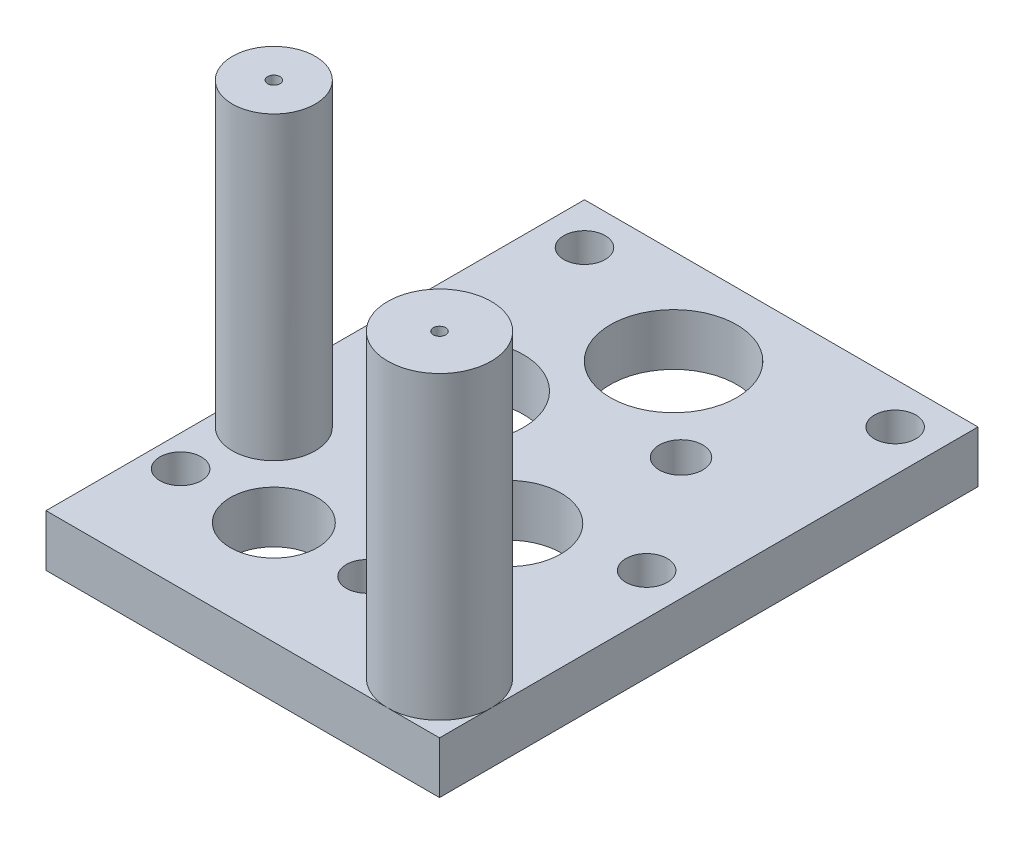
ISO-10303-21;
HEADER;
FILE_DESCRIPTION(('STEP AP214'),'2;1');
FILE_NAME('part.step','',(''),(''),'','','');
FILE_SCHEMA(('AUTOMOTIVE_DESIGN { 1 0 10303 214 1 1 1 1 }'));
ENDSEC;
DATA;
#1=APPLICATION_CONTEXT('core data for automotive mechanical design processes');
#2=APPLICATION_PROTOCOL_DEFINITION('international standard','automotive_design',2000,#1);
#3=PRODUCT_CONTEXT('',#1,'mechanical');
#4=PRODUCT('Part','Part','',(#3));
#5=PRODUCT_RELATED_PRODUCT_CATEGORY('part','',(#4));
#6=PRODUCT_DEFINITION_FORMATION('','',#4);
#7=PRODUCT_DEFINITION_CONTEXT('part definition',#1,'design');
#8=PRODUCT_DEFINITION('design','',#6,#7);
#9=PRODUCT_DEFINITION_SHAPE('','',#8);
#10=(LENGTH_UNIT() NAMED_UNIT(*) SI_UNIT(.MILLI.,.METRE.));
#11=(NAMED_UNIT(*) PLANE_ANGLE_UNIT() SI_UNIT($,.RADIAN.));
#12=(NAMED_UNIT(*) SI_UNIT($,.STERADIAN.) SOLID_ANGLE_UNIT());
#13=UNCERTAINTY_MEASURE_WITH_UNIT(LENGTH_MEASURE(1.E-05),#10,'distance_accuracy_value','');
#14=(GEOMETRIC_REPRESENTATION_CONTEXT(3) GLOBAL_UNCERTAINTY_ASSIGNED_CONTEXT((#13)) GLOBAL_UNIT_ASSIGNED_CONTEXT((#10,
#11,#12)) REPRESENTATION_CONTEXT('',''));
#15=CARTESIAN_POINT('',(0.,0.,0.));
#16=DIRECTION('',(0.,0.,1.));
#17=DIRECTION('',(1.,0.,0.));
#18=AXIS2_PLACEMENT_3D('',#15,#16,#17);
#19=CARTESIAN_POINT('',(0.,2.5,0.));
#20=DIRECTION('',(0.,-1.,0.));
#21=DIRECTION('',(0.,0.,-1.));
#22=AXIS2_PLACEMENT_3D('',#19,#20,#21);
#23=PLANE('',#22);
#24=CARTESIAN_POINT('',(11.5,2.5,12.5));
#25=DIRECTION('',(0.,1.,0.));
#26=DIRECTION('',(0.,0.,1.));
#27=AXIS2_PLACEMENT_3D('',#24,#25,#26);
#28=CIRCLE('',#27,2.5);
#29=CARTESIAN_POINT('',(11.5,2.5,15.));
#30=VERTEX_POINT('',#29);
#31=CARTESIAN_POINT('',(14.,2.5,12.5));
#32=VERTEX_POINT('',#31);
#33=EDGE_CURVE('E189',#30,#32,#28,.T.);
#34=ORIENTED_EDGE('',*,*,#33,.F.);
#35=DIRECTION('',(1.,0.,0.));
#36=VECTOR('',#35,1.);
#37=CARTESIAN_POINT('',(-5.,2.5,15.));
#38=LINE('',#37,#36);
#39=CARTESIAN_POINT('',(14.,2.5,15.));
#40=VERTEX_POINT('',#39);
#41=EDGE_CURVE('E178',#30,#40,#38,.T.);
#42=ORIENTED_EDGE('',*,*,#41,.T.);
#43=DIRECTION('',(0.,0.,1.));
#44=VECTOR('',#43,1.);
#45=CARTESIAN_POINT('',(14.,2.5,-11.));
#46=LINE('',#45,#44);
#47=EDGE_CURVE('E190',#32,#40,#46,.T.);
#48=ORIENTED_EDGE('',*,*,#47,.F.);
#49=EDGE_LOOP('',(#34,#42,#48));
#50=FACE_BOUND('',#49,.T.);
#51=ADVANCED_FACE('F112',(#50),#23,.F.);
#52=CARTESIAN_POINT('',(12.,2.5,2.99999999999999));
#53=DIRECTION('',(0.,1.,0.));
#54=DIRECTION('',(0.,0.,1.));
#55=AXIS2_PLACEMENT_3D('',#52,#53,#54);
#56=CIRCLE('',#55,1.00000000000001);
#57=CARTESIAN_POINT('',(12.,2.5,4.));
#58=VERTEX_POINT('',#57);
#59=EDGE_CURVE('E292',#58,#58,#56,.T.);
#60=ORIENTED_EDGE('',*,*,#59,.F.);
#61=EDGE_LOOP('',(#60));
#62=FACE_BOUND('',#61,.T.);
#63=CARTESIAN_POINT('',(-3.,2.5,-9.));
#64=DIRECTION('',(0.,1.,0.));
#65=DIRECTION('',(0.,0.,1.));
#66=AXIS2_PLACEMENT_3D('',#63,#64,#65);
#67=CIRCLE('',#66,1.);
#68=CARTESIAN_POINT('',(-3.,2.5,-8.));
#69=VERTEX_POINT('',#68);
#70=EDGE_CURVE('E307',#69,#69,#67,.T.);
#71=ORIENTED_EDGE('',*,*,#70,.F.);
#72=EDGE_LOOP('',(#71));
#73=FACE_BOUND('',#72,.T.);
#74=CARTESIAN_POINT('',(12.,2.5,-9.00000000000001));
#75=DIRECTION('',(0.,1.,0.));
#76=DIRECTION('',(0.,0.,1.));
#77=AXIS2_PLACEMENT_3D('',#74,#75,#76);
#78=CIRCLE('',#77,1.);
#79=CARTESIAN_POINT('',(12.,2.5,-8.));
#80=VERTEX_POINT('',#79);
#81=EDGE_CURVE('E304',#80,#80,#78,.T.);
#82=ORIENTED_EDGE('',*,*,#81,.F.);
#83=EDGE_LOOP('',(#82));
#84=FACE_BOUND('',#83,.T.);
#85=EDGE_CURVE('E129',#32,#30,#28,.T.);
#86=ORIENTED_EDGE('',*,*,#85,.F.);
#87=CARTESIAN_POINT('',(14.,2.5,-11.));
#88=VERTEX_POINT('',#87);
#89=EDGE_CURVE('E187',#88,#32,#46,.T.);
#90=ORIENTED_EDGE('',*,*,#89,.F.);
#91=DIRECTION('',(1.,0.,0.));
#92=VECTOR('',#91,1.);
#93=CARTESIAN_POINT('',(-5.,2.5,-11.));
#94=LINE('',#93,#92);
#95=CARTESIAN_POINT('',(-5.,2.5,-11.));
#96=VERTEX_POINT('',#95);
#97=EDGE_CURVE('E259',#96,#88,#94,.T.);
#98=ORIENTED_EDGE('',*,*,#97,.F.);
#99=DIRECTION('',(0.,0.,1.));
#100=VECTOR('',#99,1.);
#101=CARTESIAN_POINT('',(-5.,2.5,-11.));
#102=LINE('',#101,#100);
#103=CARTESIAN_POINT('',(-5.,2.5,6.));
#104=VERTEX_POINT('',#103);
#105=EDGE_CURVE('E263',#96,#104,#102,.T.);
#106=ORIENTED_EDGE('',*,*,#105,.T.);
#107=CARTESIAN_POINT('',(-3.,2.5,6.));
#108=DIRECTION('',(0.,1.,0.));
#109=DIRECTION('',(0.,0.,1.));
#110=AXIS2_PLACEMENT_3D('',#107,#108,#109);
#111=CIRCLE('',#110,2.);
#112=EDGE_CURVE('E192',#104,#104,#111,.T.);
#113=ORIENTED_EDGE('',*,*,#112,.F.);
#114=CARTESIAN_POINT('',(-5.,2.5,15.));
#115=VERTEX_POINT('',#114);
#116=EDGE_CURVE('E174',#104,#115,#102,.T.);
#117=ORIENTED_EDGE('',*,*,#116,.T.);
#118=EDGE_CURVE('E168',#115,#30,#38,.T.);
#119=ORIENTED_EDGE('',*,*,#118,.T.);
#120=EDGE_LOOP('',(#86,#90,#98,#106,#113,#117,#119));
#121=FACE_BOUND('',#120,.T.);
#122=CARTESIAN_POINT('',(-3.49999999999999,2.5,10.));
#123=DIRECTION('',(0.,-1.,0.));
#124=DIRECTION('',(0.,0.,-1.));
#125=AXIS2_PLACEMENT_3D('',#122,#123,#124);
#126=CIRCLE('',#125,1.);
#127=CARTESIAN_POINT('',(-3.49999999999999,2.5,9.));
#128=VERTEX_POINT('',#127);
#129=EDGE_CURVE('E219',#128,#128,#126,.T.);
#130=ORIENTED_EDGE('',*,*,#129,.T.);
#131=EDGE_LOOP('',(#130));
#132=FACE_BOUND('',#131,.T.);
#133=CARTESIAN_POINT('',(5.50000000000001,2.5,10.));
#134=DIRECTION('',(0.,-1.,0.));
#135=DIRECTION('',(0.,0.,-1.));
#136=AXIS2_PLACEMENT_3D('',#133,#134,#135);
#137=CIRCLE('',#136,1.);
#138=CARTESIAN_POINT('',(5.50000000000001,2.5,9.));
#139=VERTEX_POINT('',#138);
#140=EDGE_CURVE('E222',#139,#139,#137,.T.);
#141=ORIENTED_EDGE('',*,*,#140,.T.);
#142=EDGE_LOOP('',(#141));
#143=FACE_BOUND('',#142,.T.);
#144=CARTESIAN_POINT('',(8.10714951623889,2.5,-2.55423701354193));
#145=DIRECTION('',(0.,1.,0.));
#146=DIRECTION('',(0.,0.,1.));
#147=AXIS2_PLACEMENT_3D('',#144,#145,#146);
#148=CIRCLE('',#147,1.05);
#149=CARTESIAN_POINT('',(8.10714951623889,2.5,-1.50423701354193));
#150=VERTEX_POINT('',#149);
#151=EDGE_CURVE('E253',#150,#150,#148,.T.);
#152=ORIENTED_EDGE('',*,*,#151,.F.);
#153=EDGE_LOOP('',(#152));
#154=FACE_BOUND('',#153,.T.);
#155=CARTESIAN_POINT('',(0.,2.5,0.));
#156=DIRECTION('',(0.,1.,0.));
#157=DIRECTION('',(0.,0.,1.));
#158=AXIS2_PLACEMENT_3D('',#155,#156,#157);
#159=CIRCLE('',#158,3.05);
#160=CARTESIAN_POINT('',(0.,2.5,3.05));
#161=VERTEX_POINT('',#160);
#162=EDGE_CURVE('E247',#161,#161,#159,.T.);
#163=ORIENTED_EDGE('',*,*,#162,.F.);
#164=EDGE_LOOP('',(#163));
#165=FACE_BOUND('',#164,.T.);
#166=CARTESIAN_POINT('',(3.9,2.5,-6.4));
#167=DIRECTION('',(0.,1.,0.));
#168=DIRECTION('',(0.,0.,1.));
#169=AXIS2_PLACEMENT_3D('',#166,#167,#168);
#170=CIRCLE('',#169,3.05);
#171=CARTESIAN_POINT('',(3.9,2.5,-3.35));
#172=VERTEX_POINT('',#171);
#173=EDGE_CURVE('E241',#172,#172,#170,.T.);
#174=ORIENTED_EDGE('',*,*,#173,.F.);
#175=EDGE_LOOP('',(#174));
#176=FACE_BOUND('',#175,.T.);
#177=CARTESIAN_POINT('',(6.69405655718959,2.5,4.38059434428104));
#178=DIRECTION('',(0.,1.,0.));
#179=DIRECTION('',(0.,0.,1.));
#180=AXIS2_PLACEMENT_3D('',#177,#178,#179);
#181=CIRCLE('',#180,2.55);
#182=CARTESIAN_POINT('',(6.69405655718959,2.5,6.93059434428104));
#183=VERTEX_POINT('',#182);
#184=EDGE_CURVE('E235',#183,#183,#181,.T.);
#185=ORIENTED_EDGE('',*,*,#184,.F.);
#186=EDGE_LOOP('',(#185));
#187=FACE_BOUND('',#186,.T.);
#188=CARTESIAN_POINT('',(1.00000000000001,2.5,10.));
#189=DIRECTION('',(0.,1.,0.));
#190=DIRECTION('',(0.,0.,1.));
#191=AXIS2_PLACEMENT_3D('',#188,#189,#190);
#192=CIRCLE('',#191,2.1);
#193=CARTESIAN_POINT('',(1.00000000000001,2.5,12.1));
#194=VERTEX_POINT('',#193);
#195=EDGE_CURVE('E229',#194,#194,#192,.T.);
#196=ORIENTED_EDGE('',*,*,#195,.F.);
#197=EDGE_LOOP('',(#196));
#198=FACE_BOUND('',#197,.T.);
#199=ADVANCED_FACE('F170',(#62,#73,#84,#121,#132,#143,#154,#165,#176,#187,#198),#23,.F.);
#200=CARTESIAN_POINT('',(0.,0.,0.));
#201=DIRECTION('',(0.,-1.,0.));
#202=DIRECTION('',(0.,0.,-1.));
#203=AXIS2_PLACEMENT_3D('',#200,#201,#202);
#204=PLANE('',#203);
#205=CARTESIAN_POINT('',(12.,0.,2.99999999999999));
#206=DIRECTION('',(0.,1.,0.));
#207=DIRECTION('',(0.,0.,1.));
#208=AXIS2_PLACEMENT_3D('',#205,#206,#207);
#209=CIRCLE('',#208,0.700000000000002);
#210=CARTESIAN_POINT('',(12.,0.,3.7));
#211=VERTEX_POINT('',#210);
#212=EDGE_CURVE('E702',#211,#211,#209,.T.);
#213=ORIENTED_EDGE('',*,*,#212,.T.);
#214=EDGE_LOOP('',(#213));
#215=FACE_BOUND('',#214,.T.);
#216=CARTESIAN_POINT('',(-3.,0.,-9.));
#217=DIRECTION('',(0.,1.,0.));
#218=DIRECTION('',(0.,0.,1.));
#219=AXIS2_PLACEMENT_3D('',#216,#217,#218);
#220=CIRCLE('',#219,0.699999999999999);
#221=CARTESIAN_POINT('',(-3.,0.,-8.3));
#222=VERTEX_POINT('',#221);
#223=EDGE_CURVE('E706',#222,#222,#220,.T.);
#224=ORIENTED_EDGE('',*,*,#223,.T.);
#225=EDGE_LOOP('',(#224));
#226=FACE_BOUND('',#225,.T.);
#227=CARTESIAN_POINT('',(12.,0.,-9.00000000000001));
#228=DIRECTION('',(0.,1.,0.));
#229=DIRECTION('',(0.,0.,1.));
#230=AXIS2_PLACEMENT_3D('',#227,#228,#229);
#231=CIRCLE('',#230,0.699999999999999);
#232=CARTESIAN_POINT('',(12.,0.,-8.30000000000001));
#233=VERTEX_POINT('',#232);
#234=EDGE_CURVE('E283',#233,#233,#231,.T.);
#235=ORIENTED_EDGE('',*,*,#234,.T.);
#236=EDGE_LOOP('',(#235));
#237=FACE_BOUND('',#236,.T.);
#238=CARTESIAN_POINT('',(-3.49999999999999,0.,10.));
#239=DIRECTION('',(0.,1.,0.));
#240=DIRECTION('',(0.,0.,1.));
#241=AXIS2_PLACEMENT_3D('',#238,#239,#240);
#242=CIRCLE('',#241,0.8);
#243=CARTESIAN_POINT('',(-3.49999999999999,0.,10.8));
#244=VERTEX_POINT('',#243);
#245=EDGE_CURVE('E209',#244,#244,#242,.T.);
#246=ORIENTED_EDGE('',*,*,#245,.T.);
#247=EDGE_LOOP('',(#246));
#248=FACE_BOUND('',#247,.T.);
#249=CARTESIAN_POINT('',(5.50000000000001,0.,10.));
#250=DIRECTION('',(0.,1.,0.));
#251=DIRECTION('',(0.,0.,1.));
#252=AXIS2_PLACEMENT_3D('',#249,#250,#251);
#253=CIRCLE('',#252,0.800000000000001);
#254=CARTESIAN_POINT('',(5.50000000000001,0.,10.8));
#255=VERTEX_POINT('',#254);
#256=EDGE_CURVE('E206',#255,#255,#253,.T.);
#257=ORIENTED_EDGE('',*,*,#256,.T.);
#258=EDGE_LOOP('',(#257));
#259=FACE_BOUND('',#258,.T.);
#260=CARTESIAN_POINT('',(6.69405655718959,0.,4.38059434428104));
#261=DIRECTION('',(0.,1.,0.));
#262=DIRECTION('',(0.,0.,1.));
#263=AXIS2_PLACEMENT_3D('',#260,#261,#262);
#264=CIRCLE('',#263,2.55);
#265=CARTESIAN_POINT('',(6.69405655718959,0.,6.93059434428104));
#266=VERTEX_POINT('',#265);
#267=EDGE_CURVE('E232',#266,#266,#264,.T.);
#268=ORIENTED_EDGE('',*,*,#267,.T.);
#269=EDGE_LOOP('',(#268));
#270=FACE_BOUND('',#269,.T.);
#271=CARTESIAN_POINT('',(0.,0.,0.));
#272=DIRECTION('',(0.,1.,0.));
#273=DIRECTION('',(0.,0.,1.));
#274=AXIS2_PLACEMENT_3D('',#271,#272,#273);
#275=CIRCLE('',#274,3.05);
#276=CARTESIAN_POINT('',(0.,0.,3.05));
#277=VERTEX_POINT('',#276);
#278=EDGE_CURVE('E244',#277,#277,#275,.T.);
#279=ORIENTED_EDGE('',*,*,#278,.T.);
#280=EDGE_LOOP('',(#279));
#281=FACE_BOUND('',#280,.T.);
#282=DIRECTION('',(1.,0.,0.));
#283=VECTOR('',#282,1.);
#284=CARTESIAN_POINT('',(-5.,0.,-11.));
#285=LINE('',#284,#283);
#286=CARTESIAN_POINT('',(-5.,0.,-11.));
#287=VERTEX_POINT('',#286);
#288=CARTESIAN_POINT('',(14.,0.,-11.));
#289=VERTEX_POINT('',#288);
#290=EDGE_CURVE('E256',#287,#289,#285,.T.);
#291=ORIENTED_EDGE('',*,*,#290,.T.);
#292=DIRECTION('',(0.,0.,1.));
#293=VECTOR('',#292,1.);
#294=CARTESIAN_POINT('',(14.,0.,-11.));
#295=LINE('',#294,#293);
#296=CARTESIAN_POINT('',(14.,0.,15.));
#297=VERTEX_POINT('',#296);
#298=EDGE_CURVE('E267',#289,#297,#295,.T.);
#299=ORIENTED_EDGE('',*,*,#298,.T.);
#300=DIRECTION('',(1.,0.,0.));
#301=VECTOR('',#300,1.);
#302=CARTESIAN_POINT('',(-5.,0.,15.));
#303=LINE('',#302,#301);
#304=CARTESIAN_POINT('',(-5.,0.,15.));
#305=VERTEX_POINT('',#304);
#306=EDGE_CURVE('E270',#305,#297,#303,.T.);
#307=ORIENTED_EDGE('',*,*,#306,.F.);
#308=DIRECTION('',(0.,0.,1.));
#309=VECTOR('',#308,1.);
#310=CARTESIAN_POINT('',(-5.,0.,-11.));
#311=LINE('',#310,#309);
#312=EDGE_CURVE('E261',#287,#305,#311,.T.);
#313=ORIENTED_EDGE('',*,*,#312,.F.);
#314=EDGE_LOOP('',(#291,#299,#307,#313));
#315=FACE_BOUND('',#314,.T.);
#316=CARTESIAN_POINT('',(8.10714951623889,0.,-2.55423701354193));
#317=DIRECTION('',(0.,1.,0.));
#318=DIRECTION('',(0.,0.,1.));
#319=AXIS2_PLACEMENT_3D('',#316,#317,#318);
#320=CIRCLE('',#319,1.05);
#321=CARTESIAN_POINT('',(8.10714951623889,0.,-1.50423701354193));
#322=VERTEX_POINT('',#321);
#323=EDGE_CURVE('E250',#322,#322,#320,.T.);
#324=ORIENTED_EDGE('',*,*,#323,.T.);
#325=EDGE_LOOP('',(#324));
#326=FACE_BOUND('',#325,.T.);
#327=CARTESIAN_POINT('',(3.9,0.,-6.4));
#328=DIRECTION('',(0.,1.,0.));
#329=DIRECTION('',(0.,0.,1.));
#330=AXIS2_PLACEMENT_3D('',#327,#328,#329);
#331=CIRCLE('',#330,3.05);
#332=CARTESIAN_POINT('',(3.9,0.,-3.35));
#333=VERTEX_POINT('',#332);
#334=EDGE_CURVE('E238',#333,#333,#331,.T.);
#335=ORIENTED_EDGE('',*,*,#334,.T.);
#336=EDGE_LOOP('',(#335));
#337=FACE_BOUND('',#336,.T.);
#338=CARTESIAN_POINT('',(1.00000000000001,0.,10.));
#339=DIRECTION('',(0.,1.,0.));
#340=DIRECTION('',(0.,0.,1.));
#341=AXIS2_PLACEMENT_3D('',#338,#339,#340);
#342=CIRCLE('',#341,2.1);
#343=CARTESIAN_POINT('',(1.00000000000001,0.,12.1));
#344=VERTEX_POINT('',#343);
#345=EDGE_CURVE('E218',#344,#344,#342,.T.);
#346=ORIENTED_EDGE('',*,*,#345,.T.);
#347=EDGE_LOOP('',(#346));
#348=FACE_BOUND('',#347,.T.);
#349=ADVANCED_FACE('F340',(#215,#226,#237,#248,#259,#270,#281,#315,#326,#337,#348),#204,.T.);
#350=CARTESIAN_POINT('',(-5.,2.5,-11.));
#351=DIRECTION('',(0.,0.,-1.));
#352=DIRECTION('',(-1.,0.,0.));
#353=AXIS2_PLACEMENT_3D('',#350,#351,#352);
#354=PLANE('',#353);
#355=CARTESIAN_POINT('',(-1.00000000000001,1.25,-11.));
#356=DIRECTION('',(0.,0.,1.));
#357=DIRECTION('',(1.,0.,0.));
#358=AXIS2_PLACEMENT_3D('',#355,#356,#357);
#359=CIRCLE('',#358,0.3);
#360=CARTESIAN_POINT('',(-0.700000000000008,1.25,-11.));
#361=VERTEX_POINT('',#360);
#362=EDGE_CURVE('E703',#361,#361,#359,.T.);
#363=ORIENTED_EDGE('',*,*,#362,.T.);
#364=EDGE_LOOP('',(#363));
#365=FACE_BOUND('',#364,.T.);
#366=CARTESIAN_POINT('',(3.99999999999999,1.25,-11.));
#367=DIRECTION('',(0.,0.,1.));
#368=DIRECTION('',(1.,0.,0.));
#369=AXIS2_PLACEMENT_3D('',#366,#367,#368);
#370=CIRCLE('',#369,0.3);
#371=CARTESIAN_POINT('',(4.29999999999999,1.25,-11.));
#372=VERTEX_POINT('',#371);
#373=EDGE_CURVE('E709',#372,#372,#370,.T.);
#374=ORIENTED_EDGE('',*,*,#373,.T.);
#375=EDGE_LOOP('',(#374));
#376=FACE_BOUND('',#375,.T.);
#377=ORIENTED_EDGE('',*,*,#290,.F.);
#378=DIRECTION('',(0.,-1.,0.));
#379=VECTOR('',#378,1.);
#380=CARTESIAN_POINT('',(-5.,2.5,-11.));
#381=LINE('',#380,#379);
#382=EDGE_CURVE('E12',#96,#287,#381,.T.);
#383=ORIENTED_EDGE('',*,*,#382,.F.);
#384=ORIENTED_EDGE('',*,*,#97,.T.);
#385=DIRECTION('',(0.,-1.,0.));
#386=VECTOR('',#385,1.);
#387=CARTESIAN_POINT('',(14.,2.5,-11.));
#388=LINE('',#387,#386);
#389=EDGE_CURVE('E161',#88,#289,#388,.T.);
#390=ORIENTED_EDGE('',*,*,#389,.T.);
#391=EDGE_LOOP('',(#377,#383,#384,#390));
#392=FACE_BOUND('',#391,.T.);
#393=ADVANCED_FACE('F114',(#365,#376,#392),#354,.T.);
#394=CARTESIAN_POINT('',(-5.,2.5,-11.));
#395=DIRECTION('',(1.,0.,0.));
#396=DIRECTION('',(0.,0.,-1.));
#397=AXIS2_PLACEMENT_3D('',#394,#395,#396);
#398=PLANE('',#397);
#399=ORIENTED_EDGE('',*,*,#312,.T.);
#400=DIRECTION('',(0.,-1.,0.));
#401=VECTOR('',#400,1.);
#402=CARTESIAN_POINT('',(-5.,2.5,15.));
#403=LINE('',#402,#401);
#404=EDGE_CURVE('E121',#115,#305,#403,.T.);
#405=ORIENTED_EDGE('',*,*,#404,.F.);
#406=ORIENTED_EDGE('',*,*,#116,.F.);
#407=ORIENTED_EDGE('',*,*,#105,.F.);
#408=ORIENTED_EDGE('',*,*,#382,.T.);
#409=EDGE_LOOP('',(#399,#405,#406,#407,#408));
#410=FACE_BOUND('',#409,.T.);
#411=ADVANCED_FACE('F349',(#410),#398,.F.);
#412=CARTESIAN_POINT('',(-5.,2.5,15.));
#413=DIRECTION('',(0.,0.,-1.));
#414=DIRECTION('',(-1.,0.,0.));
#415=AXIS2_PLACEMENT_3D('',#412,#413,#414);
#416=PLANE('',#415);
#417=ORIENTED_EDGE('',*,*,#306,.T.);
#418=DIRECTION('',(0.,-1.,0.));
#419=VECTOR('',#418,1.);
#420=CARTESIAN_POINT('',(14.,2.5,15.));
#421=LINE('',#420,#419);
#422=EDGE_CURVE('E184',#40,#297,#421,.T.);
#423=ORIENTED_EDGE('',*,*,#422,.F.);
#424=ORIENTED_EDGE('',*,*,#41,.F.);
#425=ORIENTED_EDGE('',*,*,#118,.F.);
#426=ORIENTED_EDGE('',*,*,#404,.T.);
#427=EDGE_LOOP('',(#417,#423,#424,#425,#426));
#428=FACE_BOUND('',#427,.T.);
#429=ADVANCED_FACE('F183',(#428),#416,.F.);
#430=CARTESIAN_POINT('',(14.,2.5,-11.));
#431=DIRECTION('',(1.,0.,0.));
#432=DIRECTION('',(0.,0.,-1.));
#433=AXIS2_PLACEMENT_3D('',#430,#431,#432);
#434=PLANE('',#433);
#435=ORIENTED_EDGE('',*,*,#298,.F.);
#436=ORIENTED_EDGE('',*,*,#389,.F.);
#437=ORIENTED_EDGE('',*,*,#89,.T.);
#438=ORIENTED_EDGE('',*,*,#47,.T.);
#439=ORIENTED_EDGE('',*,*,#422,.T.);
#440=EDGE_LOOP('',(#435,#436,#437,#438,#439));
#441=FACE_BOUND('',#440,.T.);
#442=ADVANCED_FACE('F353',(#441),#434,.T.);
#443=CARTESIAN_POINT('',(8.10714951623889,2.5,-2.55423701354193));
#444=DIRECTION('',(0.,-1.,0.));
#445=DIRECTION('',(0.,0.,-1.));
#446=AXIS2_PLACEMENT_3D('',#443,#444,#445);
#447=CYLINDRICAL_SURFACE('',#446,1.05);
#448=ORIENTED_EDGE('',*,*,#151,.T.);
#449=EDGE_LOOP('',(#448));
#450=FACE_BOUND('',#449,.T.);
#451=ORIENTED_EDGE('',*,*,#323,.F.);
#452=EDGE_LOOP('',(#451));
#453=FACE_BOUND('',#452,.T.);
#454=ADVANCED_FACE('F344',(#450,#453),#447,.F.);
#455=CARTESIAN_POINT('',(0.,2.5,0.));
#456=DIRECTION('',(0.,-1.,0.));
#457=DIRECTION('',(0.,0.,-1.));
#458=AXIS2_PLACEMENT_3D('',#455,#456,#457);
#459=CYLINDRICAL_SURFACE('',#458,3.05);
#460=ORIENTED_EDGE('',*,*,#162,.T.);
#461=EDGE_LOOP('',(#460));
#462=FACE_BOUND('',#461,.T.);
#463=ORIENTED_EDGE('',*,*,#278,.F.);
#464=EDGE_LOOP('',(#463));
#465=FACE_BOUND('',#464,.T.);
#466=ADVANCED_FACE('F358',(#462,#465),#459,.F.);
#467=CARTESIAN_POINT('',(3.9,2.5,-6.4));
#468=DIRECTION('',(0.,-1.,0.));
#469=DIRECTION('',(0.,0.,-1.));
#470=AXIS2_PLACEMENT_3D('',#467,#468,#469);
#471=CYLINDRICAL_SURFACE('',#470,3.05);
#472=ORIENTED_EDGE('',*,*,#173,.T.);
#473=EDGE_LOOP('',(#472));
#474=FACE_BOUND('',#473,.T.);
#475=ORIENTED_EDGE('',*,*,#334,.F.);
#476=EDGE_LOOP('',(#475));
#477=FACE_BOUND('',#476,.T.);
#478=ADVANCED_FACE('F409',(#474,#477),#471,.F.);
#479=CARTESIAN_POINT('',(6.69405655718959,2.5,4.38059434428104));
#480=DIRECTION('',(0.,-1.,0.));
#481=DIRECTION('',(0.,0.,-1.));
#482=AXIS2_PLACEMENT_3D('',#479,#480,#481);
#483=CYLINDRICAL_SURFACE('',#482,2.55);
#484=ORIENTED_EDGE('',*,*,#184,.T.);
#485=EDGE_LOOP('',(#484));
#486=FACE_BOUND('',#485,.T.);
#487=ORIENTED_EDGE('',*,*,#267,.F.);
#488=EDGE_LOOP('',(#487));
#489=FACE_BOUND('',#488,.T.);
#490=ADVANCED_FACE('F405',(#486,#489),#483,.F.);
#491=CARTESIAN_POINT('',(1.00000000000001,2.5,10.));
#492=DIRECTION('',(0.,-1.,0.));
#493=DIRECTION('',(0.,0.,-1.));
#494=AXIS2_PLACEMENT_3D('',#491,#492,#493);
#495=CYLINDRICAL_SURFACE('',#494,2.1);
#496=ORIENTED_EDGE('',*,*,#195,.T.);
#497=EDGE_LOOP('',(#496));
#498=FACE_BOUND('',#497,.T.);
#499=ORIENTED_EDGE('',*,*,#345,.F.);
#500=EDGE_LOOP('',(#499));
#501=FACE_BOUND('',#500,.T.);
#502=ADVANCED_FACE('F398',(#498,#501),#495,.F.);
#503=CARTESIAN_POINT('',(5.50000000000001,1.,10.));
#504=DIRECTION('',(0.,1.,0.));
#505=DIRECTION('',(0.,0.,1.));
#506=AXIS2_PLACEMENT_3D('',#503,#504,#505);
#507=CYLINDRICAL_SURFACE('',#506,1.);
#508=CARTESIAN_POINT('',(5.50000000000001,1.,10.));
#509=DIRECTION('',(0.,-1.,0.));
#510=DIRECTION('',(0.,0.,-1.));
#511=AXIS2_PLACEMENT_3D('',#508,#509,#510);
#512=CIRCLE('',#511,1.);
#513=CARTESIAN_POINT('',(5.50000000000001,1.,9.));
#514=VERTEX_POINT('',#513);
#515=EDGE_CURVE('E225',#514,#514,#512,.T.);
#516=ORIENTED_EDGE('',*,*,#515,.T.);
#517=EDGE_LOOP('',(#516));
#518=FACE_BOUND('',#517,.T.);
#519=ORIENTED_EDGE('',*,*,#140,.F.);
#520=EDGE_LOOP('',(#519));
#521=FACE_BOUND('',#520,.T.);
#522=ADVANCED_FACE('F395',(#518,#521),#507,.F.);
#523=CARTESIAN_POINT('',(5.50000000000001,1.,10.));
#524=DIRECTION('',(0.,-1.,0.));
#525=DIRECTION('',(0.,0.,-1.));
#526=AXIS2_PLACEMENT_3D('',#523,#524,#525);
#527=PLANE('',#526);
#528=CARTESIAN_POINT('',(5.50000000000001,1.,10.));
#529=DIRECTION('',(0.,-1.,0.));
#530=DIRECTION('',(0.,0.,-1.));
#531=AXIS2_PLACEMENT_3D('',#528,#529,#530);
#532=CIRCLE('',#531,0.800000000000001);
#533=CARTESIAN_POINT('',(5.50000000000001,1.,9.2));
#534=VERTEX_POINT('',#533);
#535=EDGE_CURVE('E228',#534,#534,#532,.F.);
#536=ORIENTED_EDGE('',*,*,#535,.F.);
#537=EDGE_LOOP('',(#536));
#538=FACE_BOUND('',#537,.T.);
#539=ORIENTED_EDGE('',*,*,#515,.F.);
#540=EDGE_LOOP('',(#539));
#541=FACE_BOUND('',#540,.T.);
#542=ADVANCED_FACE('F393',(#538,#541),#527,.F.);
#543=CARTESIAN_POINT('',(-3.49999999999999,1.,10.));
#544=DIRECTION('',(0.,1.,0.));
#545=DIRECTION('',(0.,0.,1.));
#546=AXIS2_PLACEMENT_3D('',#543,#544,#545);
#547=CYLINDRICAL_SURFACE('',#546,1.);
#548=CARTESIAN_POINT('',(-3.49999999999999,1.,10.));
#549=DIRECTION('',(0.,-1.,0.));
#550=DIRECTION('',(0.,0.,-1.));
#551=AXIS2_PLACEMENT_3D('',#548,#549,#550);
#552=CIRCLE('',#551,1.);
#553=CARTESIAN_POINT('',(-3.49999999999999,1.,9.));
#554=VERTEX_POINT('',#553);
#555=EDGE_CURVE('E215',#554,#554,#552,.T.);
#556=ORIENTED_EDGE('',*,*,#555,.T.);
#557=EDGE_LOOP('',(#556));
#558=FACE_BOUND('',#557,.T.);
#559=ORIENTED_EDGE('',*,*,#129,.F.);
#560=EDGE_LOOP('',(#559));
#561=FACE_BOUND('',#560,.T.);
#562=ADVANCED_FACE('F389',(#558,#561),#547,.F.);
#563=CARTESIAN_POINT('',(-3.49999999999999,1.,10.));
#564=DIRECTION('',(0.,-1.,0.));
#565=DIRECTION('',(0.,0.,-1.));
#566=AXIS2_PLACEMENT_3D('',#563,#564,#565);
#567=PLANE('',#566);
#568=CARTESIAN_POINT('',(-3.49999999999999,1.,10.));
#569=DIRECTION('',(0.,-1.,0.));
#570=DIRECTION('',(0.,0.,-1.));
#571=AXIS2_PLACEMENT_3D('',#568,#569,#570);
#572=CIRCLE('',#571,0.8);
#573=CARTESIAN_POINT('',(-3.49999999999999,1.,9.2));
#574=VERTEX_POINT('',#573);
#575=EDGE_CURVE('E212',#574,#574,#572,.F.);
#576=ORIENTED_EDGE('',*,*,#575,.F.);
#577=EDGE_LOOP('',(#576));
#578=FACE_BOUND('',#577,.T.);
#579=ORIENTED_EDGE('',*,*,#555,.F.);
#580=EDGE_LOOP('',(#579));
#581=FACE_BOUND('',#580,.T.);
#582=ADVANCED_FACE('F384',(#578,#581),#567,.F.);
#583=CARTESIAN_POINT('',(-3.49999999999999,1.5,10.));
#584=DIRECTION('',(0.,-1.,0.));
#585=DIRECTION('',(0.,0.,-1.));
#586=AXIS2_PLACEMENT_3D('',#583,#584,#585);
#587=CYLINDRICAL_SURFACE('',#586,0.8);
#588=ORIENTED_EDGE('',*,*,#245,.F.);
#589=EDGE_LOOP('',(#588));
#590=FACE_BOUND('',#589,.T.);
#591=ORIENTED_EDGE('',*,*,#575,.T.);
#592=EDGE_LOOP('',(#591));
#593=FACE_BOUND('',#592,.T.);
#594=ADVANCED_FACE('F377',(#590,#593),#587,.F.);
#595=CARTESIAN_POINT('',(5.50000000000001,1.5,10.));
#596=DIRECTION('',(0.,-1.,0.));
#597=DIRECTION('',(0.,0.,-1.));
#598=AXIS2_PLACEMENT_3D('',#595,#596,#597);
#599=CYLINDRICAL_SURFACE('',#598,0.800000000000001);
#600=ORIENTED_EDGE('',*,*,#256,.F.);
#601=EDGE_LOOP('',(#600));
#602=FACE_BOUND('',#601,.T.);
#603=ORIENTED_EDGE('',*,*,#535,.T.);
#604=EDGE_LOOP('',(#603));
#605=FACE_BOUND('',#604,.T.);
#606=ADVANCED_FACE('F368',(#602,#605),#599,.F.);
#607=CARTESIAN_POINT('',(-3.,17.,6.));
#608=DIRECTION('',(0.,-1.,0.));
#609=DIRECTION('',(0.,0.,-1.));
#610=AXIS2_PLACEMENT_3D('',#607,#608,#609);
#611=CYLINDRICAL_SURFACE('',#610,2.);
#612=CARTESIAN_POINT('',(-3.,17.,6.));
#613=DIRECTION('',(0.,1.,0.));
#614=DIRECTION('',(0.,0.,1.));
#615=AXIS2_PLACEMENT_3D('',#612,#613,#614);
#616=CIRCLE('',#615,2.);
#617=CARTESIAN_POINT('',(-3.,17.,8.));
#618=VERTEX_POINT('',#617);
#619=EDGE_CURVE('E203',#618,#618,#616,.T.);
#620=ORIENTED_EDGE('',*,*,#619,.F.);
#621=EDGE_LOOP('',(#620));
#622=FACE_BOUND('',#621,.T.);
#623=ORIENTED_EDGE('',*,*,#112,.T.);
#624=EDGE_LOOP('',(#623));
#625=FACE_BOUND('',#624,.T.);
#626=ADVANCED_FACE('F365',(#622,#625),#611,.T.);
#627=CARTESIAN_POINT('',(-3.,17.,6.));
#628=DIRECTION('',(0.,1.,0.));
#629=DIRECTION('',(0.,0.,1.));
#630=AXIS2_PLACEMENT_3D('',#627,#628,#629);
#631=PLANE('',#630);
#632=CARTESIAN_POINT('',(-3.,17.,6.));
#633=DIRECTION('',(0.,1.,0.));
#634=DIRECTION('',(0.,0.,1.));
#635=AXIS2_PLACEMENT_3D('',#632,#633,#634);
#636=CIRCLE('',#635,0.3);
#637=CARTESIAN_POINT('',(-3.,17.,6.3));
#638=VERTEX_POINT('',#637);
#639=EDGE_CURVE('E312',#638,#638,#636,.T.);
#640=ORIENTED_EDGE('',*,*,#639,.F.);
#641=EDGE_LOOP('',(#640));
#642=FACE_BOUND('',#641,.T.);
#643=ORIENTED_EDGE('',*,*,#619,.T.);
#644=EDGE_LOOP('',(#643));
#645=FACE_BOUND('',#644,.T.);
#646=ADVANCED_FACE('F367',(#642,#645),#631,.T.);
#647=CARTESIAN_POINT('',(11.5,17.,12.5));
#648=DIRECTION('',(0.,-1.,0.));
#649=DIRECTION('',(0.,0.,-1.));
#650=AXIS2_PLACEMENT_3D('',#647,#648,#649);
#651=CYLINDRICAL_SURFACE('',#650,2.5);
#652=CARTESIAN_POINT('',(11.5,17.,12.5));
#653=DIRECTION('',(0.,1.,0.));
#654=DIRECTION('',(0.,0.,1.));
#655=AXIS2_PLACEMENT_3D('',#652,#653,#654);
#656=CIRCLE('',#655,2.5);
#657=CARTESIAN_POINT('',(11.5,17.,15.));
#658=VERTEX_POINT('',#657);
#659=EDGE_CURVE('E195',#658,#658,#656,.T.);
#660=ORIENTED_EDGE('',*,*,#659,.F.);
#661=EDGE_LOOP('',(#660));
#662=FACE_BOUND('',#661,.T.);
#663=ORIENTED_EDGE('',*,*,#33,.T.);
#664=ORIENTED_EDGE('',*,*,#85,.T.);
#665=EDGE_LOOP('',(#663,#664));
#666=FACE_BOUND('',#665,.T.);
#667=ADVANCED_FACE('F194',(#662,#666),#651,.T.);
#668=CARTESIAN_POINT('',(11.5,17.,12.5));
#669=DIRECTION('',(0.,1.,0.));
#670=DIRECTION('',(0.,0.,1.));
#671=AXIS2_PLACEMENT_3D('',#668,#669,#670);
#672=PLANE('',#671);
#673=CARTESIAN_POINT('',(11.5,17.,12.5));
#674=DIRECTION('',(0.,1.,0.));
#675=DIRECTION('',(0.,0.,1.));
#676=AXIS2_PLACEMENT_3D('',#673,#674,#675);
#677=CIRCLE('',#676,0.3);
#678=CARTESIAN_POINT('',(11.5,17.,12.8));
#679=VERTEX_POINT('',#678);
#680=EDGE_CURVE('E310',#679,#679,#677,.T.);
#681=ORIENTED_EDGE('',*,*,#680,.F.);
#682=EDGE_LOOP('',(#681));
#683=FACE_BOUND('',#682,.T.);
#684=ORIENTED_EDGE('',*,*,#659,.T.);
#685=EDGE_LOOP('',(#684));
#686=FACE_BOUND('',#685,.T.);
#687=ADVANCED_FACE('F512',(#683,#686),#672,.T.);
#688=CARTESIAN_POINT('',(11.5,15.5,12.5));
#689=DIRECTION('',(0.,1.,0.));
#690=DIRECTION('',(0.,0.,1.));
#691=AXIS2_PLACEMENT_3D('',#688,#689,#690);
#692=CYLINDRICAL_SURFACE('',#691,0.3);
#693=CARTESIAN_POINT('',(11.5,15.5,12.5));
#694=DIRECTION('',(0.,1.,0.));
#695=DIRECTION('',(0.,0.,1.));
#696=AXIS2_PLACEMENT_3D('',#693,#694,#695);
#697=CIRCLE('',#696,0.3);
#698=CARTESIAN_POINT('',(11.5,15.5,12.8));
#699=VERTEX_POINT('',#698);
#700=EDGE_CURVE('E197',#699,#699,#697,.T.);
#701=ORIENTED_EDGE('',*,*,#700,.F.);
#702=EDGE_LOOP('',(#701));
#703=FACE_BOUND('',#702,.T.);
#704=ORIENTED_EDGE('',*,*,#680,.T.);
#705=EDGE_LOOP('',(#704));
#706=FACE_BOUND('',#705,.T.);
#707=ADVANCED_FACE('F331',(#703,#706),#692,.F.);
#708=CARTESIAN_POINT('',(11.5,15.5,12.5));
#709=DIRECTION('',(0.,1.,0.));
#710=DIRECTION('',(0.,0.,1.));
#711=AXIS2_PLACEMENT_3D('',#708,#709,#710);
#712=PLANE('',#711);
#713=ORIENTED_EDGE('',*,*,#700,.T.);
#714=EDGE_LOOP('',(#713));
#715=FACE_BOUND('',#714,.T.);
#716=ADVANCED_FACE('F323',(#715),#712,.T.);
#717=CARTESIAN_POINT('',(-3.,15.5,6.));
#718=DIRECTION('',(0.,1.,0.));
#719=DIRECTION('',(0.,0.,1.));
#720=AXIS2_PLACEMENT_3D('',#717,#718,#719);
#721=CYLINDRICAL_SURFACE('',#720,0.3);
#722=CARTESIAN_POINT('',(-3.,15.5,6.));
#723=DIRECTION('',(0.,1.,0.));
#724=DIRECTION('',(0.,0.,1.));
#725=AXIS2_PLACEMENT_3D('',#722,#723,#724);
#726=CIRCLE('',#725,0.3);
#727=CARTESIAN_POINT('',(-3.,15.5,6.3));
#728=VERTEX_POINT('',#727);
#729=EDGE_CURVE('E200',#728,#728,#726,.T.);
#730=ORIENTED_EDGE('',*,*,#729,.F.);
#731=EDGE_LOOP('',(#730));
#732=FACE_BOUND('',#731,.T.);
#733=ORIENTED_EDGE('',*,*,#639,.T.);
#734=EDGE_LOOP('',(#733));
#735=FACE_BOUND('',#734,.T.);
#736=ADVANCED_FACE('F321',(#732,#735),#721,.F.);
#737=CARTESIAN_POINT('',(-3.,15.5,6.));
#738=DIRECTION('',(0.,1.,0.));
#739=DIRECTION('',(0.,0.,1.));
#740=AXIS2_PLACEMENT_3D('',#737,#738,#739);
#741=PLANE('',#740);
#742=ORIENTED_EDGE('',*,*,#729,.T.);
#743=EDGE_LOOP('',(#742));
#744=FACE_BOUND('',#743,.T.);
#745=ADVANCED_FACE('F319',(#744),#741,.T.);
#746=CARTESIAN_POINT('',(12.,1.,-9.00000000000001));
#747=DIRECTION('',(0.,1.,0.));
#748=DIRECTION('',(0.,0.,1.));
#749=AXIS2_PLACEMENT_3D('',#746,#747,#748);
#750=CYLINDRICAL_SURFACE('',#749,1.);
#751=CARTESIAN_POINT('',(12.,1.,-9.00000000000001));
#752=DIRECTION('',(0.,1.,0.));
#753=DIRECTION('',(0.,0.,1.));
#754=AXIS2_PLACEMENT_3D('',#751,#752,#753);
#755=CIRCLE('',#754,1.);
#756=CARTESIAN_POINT('',(12.,1.,-8.));
#757=VERTEX_POINT('',#756);
#758=EDGE_CURVE('E301',#757,#757,#755,.T.);
#759=ORIENTED_EDGE('',*,*,#758,.F.);
#760=EDGE_LOOP('',(#759));
#761=FACE_BOUND('',#760,.T.);
#762=ORIENTED_EDGE('',*,*,#81,.T.);
#763=EDGE_LOOP('',(#762));
#764=FACE_BOUND('',#763,.T.);
#765=ADVANCED_FACE('F329',(#761,#764),#750,.F.);
#766=CARTESIAN_POINT('',(12.,1.,-9.00000000000001));
#767=DIRECTION('',(0.,1.,0.));
#768=DIRECTION('',(0.,0.,1.));
#769=AXIS2_PLACEMENT_3D('',#766,#767,#768);
#770=PLANE('',#769);
#771=CARTESIAN_POINT('',(12.,1.,-9.00000000000001));
#772=DIRECTION('',(0.,1.,0.));
#773=DIRECTION('',(0.,0.,1.));
#774=AXIS2_PLACEMENT_3D('',#771,#772,#773);
#775=CIRCLE('',#774,0.699999999999999);
#776=CARTESIAN_POINT('',(12.,1.,-8.30000000000001));
#777=VERTEX_POINT('',#776);
#778=EDGE_CURVE('E116',#777,#777,#775,.T.);
#779=ORIENTED_EDGE('',*,*,#778,.F.);
#780=EDGE_LOOP('',(#779));
#781=FACE_BOUND('',#780,.T.);
#782=ORIENTED_EDGE('',*,*,#758,.T.);
#783=EDGE_LOOP('',(#782));
#784=FACE_BOUND('',#783,.T.);
#785=ADVANCED_FACE('F566',(#781,#784),#770,.T.);
#786=CARTESIAN_POINT('',(-3.,1.,-9.));
#787=DIRECTION('',(0.,1.,0.));
#788=DIRECTION('',(0.,0.,1.));
#789=AXIS2_PLACEMENT_3D('',#786,#787,#788);
#790=CYLINDRICAL_SURFACE('',#789,1.);
#791=CARTESIAN_POINT('',(-3.,1.,-9.));
#792=DIRECTION('',(0.,1.,0.));
#793=DIRECTION('',(0.,0.,1.));
#794=AXIS2_PLACEMENT_3D('',#791,#792,#793);
#795=CIRCLE('',#794,1.);
#796=CARTESIAN_POINT('',(-3.,1.,-8.));
#797=VERTEX_POINT('',#796);
#798=EDGE_CURVE('E297',#797,#797,#795,.T.);
#799=ORIENTED_EDGE('',*,*,#798,.F.);
#800=EDGE_LOOP('',(#799));
#801=FACE_BOUND('',#800,.T.);
#802=ORIENTED_EDGE('',*,*,#70,.T.);
#803=EDGE_LOOP('',(#802));
#804=FACE_BOUND('',#803,.T.);
#805=ADVANCED_FACE('F574',(#801,#804),#790,.F.);
#806=CARTESIAN_POINT('',(-3.,1.,-9.));
#807=DIRECTION('',(0.,1.,0.));
#808=DIRECTION('',(0.,0.,1.));
#809=AXIS2_PLACEMENT_3D('',#806,#807,#808);
#810=PLANE('',#809);
#811=CARTESIAN_POINT('',(-3.,1.,-9.));
#812=DIRECTION('',(0.,1.,0.));
#813=DIRECTION('',(0.,0.,1.));
#814=AXIS2_PLACEMENT_3D('',#811,#812,#813);
#815=CIRCLE('',#814,0.699999999999999);
#816=CARTESIAN_POINT('',(-3.,1.,-8.3));
#817=VERTEX_POINT('',#816);
#818=EDGE_CURVE('E282',#817,#817,#815,.T.);
#819=ORIENTED_EDGE('',*,*,#818,.F.);
#820=EDGE_LOOP('',(#819));
#821=FACE_BOUND('',#820,.T.);
#822=ORIENTED_EDGE('',*,*,#798,.T.);
#823=EDGE_LOOP('',(#822));
#824=FACE_BOUND('',#823,.T.);
#825=ADVANCED_FACE('F579',(#821,#824),#810,.T.);
#826=CARTESIAN_POINT('',(12.,1.,2.99999999999999));
#827=DIRECTION('',(0.,1.,0.));
#828=DIRECTION('',(0.,0.,1.));
#829=AXIS2_PLACEMENT_3D('',#826,#827,#828);
#830=CYLINDRICAL_SURFACE('',#829,1.00000000000001);
#831=CARTESIAN_POINT('',(12.,1.,2.99999999999999));
#832=DIRECTION('',(0.,1.,0.));
#833=DIRECTION('',(0.,0.,1.));
#834=AXIS2_PLACEMENT_3D('',#831,#832,#833);
#835=CIRCLE('',#834,1.00000000000001);
#836=CARTESIAN_POINT('',(12.,1.,4.));
#837=VERTEX_POINT('',#836);
#838=EDGE_CURVE('E288',#837,#837,#835,.T.);
#839=ORIENTED_EDGE('',*,*,#838,.F.);
#840=EDGE_LOOP('',(#839));
#841=FACE_BOUND('',#840,.T.);
#842=ORIENTED_EDGE('',*,*,#59,.T.);
#843=EDGE_LOOP('',(#842));
#844=FACE_BOUND('',#843,.T.);
#845=ADVANCED_FACE('F587',(#841,#844),#830,.F.);
#846=CARTESIAN_POINT('',(12.,1.,2.99999999999999));
#847=DIRECTION('',(0.,1.,0.));
#848=DIRECTION('',(0.,0.,1.));
#849=AXIS2_PLACEMENT_3D('',#846,#847,#848);
#850=PLANE('',#849);
#851=CARTESIAN_POINT('',(12.,1.,2.99999999999999));
#852=DIRECTION('',(0.,1.,0.));
#853=DIRECTION('',(0.,0.,1.));
#854=AXIS2_PLACEMENT_3D('',#851,#852,#853);
#855=CIRCLE('',#854,0.700000000000002);
#856=CARTESIAN_POINT('',(12.,1.,3.7));
#857=VERTEX_POINT('',#856);
#858=EDGE_CURVE('E280',#857,#857,#855,.T.);
#859=ORIENTED_EDGE('',*,*,#858,.F.);
#860=EDGE_LOOP('',(#859));
#861=FACE_BOUND('',#860,.T.);
#862=ORIENTED_EDGE('',*,*,#838,.T.);
#863=EDGE_LOOP('',(#862));
#864=FACE_BOUND('',#863,.T.);
#865=ADVANCED_FACE('F592',(#861,#864),#850,.T.);
#866=CARTESIAN_POINT('',(12.,0.,2.99999999999999));
#867=DIRECTION('',(0.,1.,0.));
#868=DIRECTION('',(0.,0.,1.));
#869=AXIS2_PLACEMENT_3D('',#866,#867,#868);
#870=CYLINDRICAL_SURFACE('',#869,0.700000000000002);
#871=ORIENTED_EDGE('',*,*,#858,.T.);
#872=EDGE_LOOP('',(#871));
#873=FACE_BOUND('',#872,.T.);
#874=ORIENTED_EDGE('',*,*,#212,.F.);
#875=EDGE_LOOP('',(#874));
#876=FACE_BOUND('',#875,.T.);
#877=ADVANCED_FACE('F621',(#873,#876),#870,.F.);
#878=CARTESIAN_POINT('',(-3.,0.,-9.));
#879=DIRECTION('',(0.,1.,0.));
#880=DIRECTION('',(0.,0.,1.));
#881=AXIS2_PLACEMENT_3D('',#878,#879,#880);
#882=CYLINDRICAL_SURFACE('',#881,0.699999999999999);
#883=ORIENTED_EDGE('',*,*,#818,.T.);
#884=EDGE_LOOP('',(#883));
#885=FACE_BOUND('',#884,.T.);
#886=ORIENTED_EDGE('',*,*,#223,.F.);
#887=EDGE_LOOP('',(#886));
#888=FACE_BOUND('',#887,.T.);
#889=ADVANCED_FACE('F631',(#885,#888),#882,.F.);
#890=CARTESIAN_POINT('',(12.,0.,-9.00000000000001));
#891=DIRECTION('',(0.,1.,0.));
#892=DIRECTION('',(0.,0.,1.));
#893=AXIS2_PLACEMENT_3D('',#890,#891,#892);
#894=CYLINDRICAL_SURFACE('',#893,0.699999999999999);
#895=ORIENTED_EDGE('',*,*,#778,.T.);
#896=EDGE_LOOP('',(#895));
#897=FACE_BOUND('',#896,.T.);
#898=ORIENTED_EDGE('',*,*,#234,.F.);
#899=EDGE_LOOP('',(#898));
#900=FACE_BOUND('',#899,.T.);
#901=ADVANCED_FACE('F641',(#897,#900),#894,.F.);
#902=CARTESIAN_POINT('',(3.99999999999999,1.25,-9.5));
#903=DIRECTION('',(0.,0.,-1.));
#904=DIRECTION('',(-1.,0.,0.));
#905=AXIS2_PLACEMENT_3D('',#902,#903,#904);
#906=CYLINDRICAL_SURFACE('',#905,0.3);
#907=CARTESIAN_POINT('',(3.99999999999999,1.25,-9.5));
#908=DIRECTION('',(0.,0.,1.));
#909=DIRECTION('',(1.,0.,0.));
#910=AXIS2_PLACEMENT_3D('',#907,#908,#909);
#911=CIRCLE('',#910,0.3);
#912=CARTESIAN_POINT('',(4.29999999999999,1.25,-9.5));
#913=VERTEX_POINT('',#912);
#914=EDGE_CURVE('E714',#913,#913,#911,.T.);
#915=ORIENTED_EDGE('',*,*,#914,.T.);
#916=EDGE_LOOP('',(#915));
#917=FACE_BOUND('',#916,.T.);
#918=ORIENTED_EDGE('',*,*,#373,.F.);
#919=EDGE_LOOP('',(#918));
#920=FACE_BOUND('',#919,.T.);
#921=ADVANCED_FACE('F650',(#917,#920),#906,.F.);
#922=CARTESIAN_POINT('',(3.99999999999999,1.25,-9.5));
#923=DIRECTION('',(0.,0.,1.));
#924=DIRECTION('',(1.,0.,0.));
#925=AXIS2_PLACEMENT_3D('',#922,#923,#924);
#926=PLANE('',#925);
#927=ORIENTED_EDGE('',*,*,#914,.F.);
#928=EDGE_LOOP('',(#927));
#929=FACE_BOUND('',#928,.T.);
#930=ADVANCED_FACE('F665',(#929),#926,.F.);
#931=CARTESIAN_POINT('',(-1.00000000000001,1.25,-9.5));
#932=DIRECTION('',(0.,0.,-1.));
#933=DIRECTION('',(-1.,0.,0.));
#934=AXIS2_PLACEMENT_3D('',#931,#932,#933);
#935=CYLINDRICAL_SURFACE('',#934,0.3);
#936=CARTESIAN_POINT('',(-1.00000000000001,1.25,-9.5));
#937=DIRECTION('',(0.,0.,1.));
#938=DIRECTION('',(1.,0.,0.));
#939=AXIS2_PLACEMENT_3D('',#936,#937,#938);
#940=CIRCLE('',#939,0.3);
#941=CARTESIAN_POINT('',(-0.700000000000008,1.25,-9.5));
#942=VERTEX_POINT('',#941);
#943=EDGE_CURVE('E701',#942,#942,#940,.T.);
#944=ORIENTED_EDGE('',*,*,#943,.T.);
#945=EDGE_LOOP('',(#944));
#946=FACE_BOUND('',#945,.T.);
#947=ORIENTED_EDGE('',*,*,#362,.F.);
#948=EDGE_LOOP('',(#947));
#949=FACE_BOUND('',#948,.T.);
#950=ADVANCED_FACE('F675',(#946,#949),#935,.F.);
#951=CARTESIAN_POINT('',(-1.00000000000001,1.25,-9.5));
#952=DIRECTION('',(0.,0.,1.));
#953=DIRECTION('',(1.,0.,0.));
#954=AXIS2_PLACEMENT_3D('',#951,#952,#953);
#955=PLANE('',#954);
#956=ORIENTED_EDGE('',*,*,#943,.F.);
#957=EDGE_LOOP('',(#956));
#958=FACE_BOUND('',#957,.T.);
#959=ADVANCED_FACE('F685',(#958),#955,.F.);
#960=CLOSED_SHELL('',(#51,#199,#349,#393,#411,#429,#442,#454,#466,#478,#490,#502,#522,#542,#562,
#582,#594,#606,#626,#646,#667,#687,#707,#716,#736,#745,#765,#785,#805,#825,#845,#865,#877,#889,
#901,#921,#930,#950,#959));
#961=MANIFOLD_SOLID_BREP('B2',#960);
#962=ADVANCED_BREP_SHAPE_REPRESENTATION('',(#18,#961),#14);
#963=SHAPE_DEFINITION_REPRESENTATION(#9,#962);
ENDSEC;
END-ISO-10303-21;
